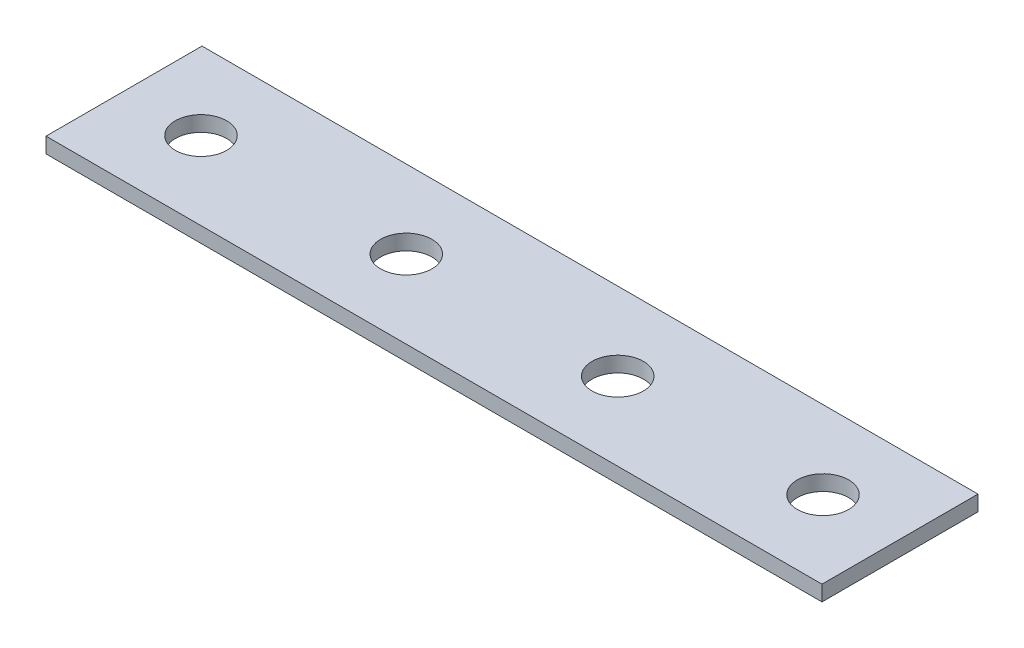
ISO-10303-21;
HEADER;
FILE_DESCRIPTION(('STEP AP214'),'2;1');
FILE_NAME('part.step','',(''),(''),'','','');
FILE_SCHEMA(('AUTOMOTIVE_DESIGN { 1 0 10303 214 1 1 1 1 }'));
ENDSEC;
DATA;
#1=APPLICATION_CONTEXT('core data for automotive mechanical design processes');
#2=APPLICATION_PROTOCOL_DEFINITION('international standard','automotive_design',2000,#1);
#3=PRODUCT_CONTEXT('',#1,'mechanical');
#4=PRODUCT('Part','Part','',(#3));
#5=PRODUCT_RELATED_PRODUCT_CATEGORY('part','',(#4));
#6=PRODUCT_DEFINITION_FORMATION('','',#4);
#7=PRODUCT_DEFINITION_CONTEXT('part definition',#1,'design');
#8=PRODUCT_DEFINITION('design','',#6,#7);
#9=PRODUCT_DEFINITION_SHAPE('','',#8);
#10=(LENGTH_UNIT() NAMED_UNIT(*) SI_UNIT(.MILLI.,.METRE.));
#11=(NAMED_UNIT(*) PLANE_ANGLE_UNIT() SI_UNIT($,.RADIAN.));
#12=(NAMED_UNIT(*) SI_UNIT($,.STERADIAN.) SOLID_ANGLE_UNIT());
#13=UNCERTAINTY_MEASURE_WITH_UNIT(LENGTH_MEASURE(1.E-05),#10,'distance_accuracy_value','');
#14=(GEOMETRIC_REPRESENTATION_CONTEXT(3) GLOBAL_UNCERTAINTY_ASSIGNED_CONTEXT((#13)) GLOBAL_UNIT_ASSIGNED_CONTEXT((#10,
#11,#12)) REPRESENTATION_CONTEXT('',''));
#15=CARTESIAN_POINT('',(0.,0.,0.));
#16=DIRECTION('',(0.,0.,1.));
#17=DIRECTION('',(1.,0.,0.));
#18=AXIS2_PLACEMENT_3D('',#15,#16,#17);
#19=CARTESIAN_POINT('',(0.,1.5,0.));
#20=DIRECTION('',(0.,-1.,0.));
#21=DIRECTION('',(0.,0.,-1.));
#22=AXIS2_PLACEMENT_3D('',#19,#20,#21);
#23=PLANE('',#22);
#24=DIRECTION('',(0.,0.,1.));
#25=VECTOR('',#24,1.);
#26=CARTESIAN_POINT('',(-37.8,1.5,-7.6));
#27=LINE('',#26,#25);
#28=CARTESIAN_POINT('',(-37.8,1.5,-7.6));
#29=VERTEX_POINT('',#28);
#30=CARTESIAN_POINT('',(-37.8,1.5,7.6));
#31=VERTEX_POINT('',#30);
#32=EDGE_CURVE('E88',#29,#31,#27,.T.);
#33=ORIENTED_EDGE('',*,*,#32,.T.);
#34=DIRECTION('',(1.,0.,0.));
#35=VECTOR('',#34,1.);
#36=CARTESIAN_POINT('',(37.8,1.5,7.6));
#37=LINE('',#36,#35);
#38=CARTESIAN_POINT('',(37.8,1.5,7.6));
#39=VERTEX_POINT('',#38);
#40=EDGE_CURVE('E83',#31,#39,#37,.T.);
#41=ORIENTED_EDGE('',*,*,#40,.T.);
#42=DIRECTION('',(0.,0.,-1.));
#43=VECTOR('',#42,1.);
#44=CARTESIAN_POINT('',(37.8,1.5,-7.6));
#45=LINE('',#44,#43);
#46=CARTESIAN_POINT('',(37.8,1.5,-7.6));
#47=VERTEX_POINT('',#46);
#48=EDGE_CURVE('E86',#39,#47,#45,.T.);
#49=ORIENTED_EDGE('',*,*,#48,.T.);
#50=DIRECTION('',(-1.,0.,0.));
#51=VECTOR('',#50,1.);
#52=CARTESIAN_POINT('',(37.8,1.5,-7.6));
#53=LINE('',#52,#51);
#54=EDGE_CURVE('E53',#47,#29,#53,.T.);
#55=ORIENTED_EDGE('',*,*,#54,.T.);
#56=EDGE_LOOP('',(#33,#41,#49,#55));
#57=FACE_BOUND('',#56,.T.);
#58=CARTESIAN_POINT('',(-30.3,1.5,0.));
#59=DIRECTION('',(0.,1.,0.));
#60=DIRECTION('',(0.,0.,1.));
#61=AXIS2_PLACEMENT_3D('',#58,#59,#60);
#62=CIRCLE('',#61,2.5);
#63=CARTESIAN_POINT('',(-30.3,1.5,2.5));
#64=VERTEX_POINT('',#63);
#65=EDGE_CURVE('E103',#64,#64,#62,.T.);
#66=ORIENTED_EDGE('',*,*,#65,.F.);
#67=EDGE_LOOP('',(#66));
#68=FACE_BOUND('',#67,.T.);
#69=CARTESIAN_POINT('',(-10.3,1.5,0.));
#70=DIRECTION('',(0.,1.,0.));
#71=DIRECTION('',(0.,0.,1.));
#72=AXIS2_PLACEMENT_3D('',#69,#70,#71);
#73=CIRCLE('',#72,2.5);
#74=CARTESIAN_POINT('',(-10.3,1.5,2.5));
#75=VERTEX_POINT('',#74);
#76=EDGE_CURVE('E118',#75,#75,#73,.T.);
#77=ORIENTED_EDGE('',*,*,#76,.F.);
#78=EDGE_LOOP('',(#77));
#79=FACE_BOUND('',#78,.T.);
#80=CARTESIAN_POINT('',(10.3,1.5,0.));
#81=DIRECTION('',(0.,1.,0.));
#82=DIRECTION('',(0.,0.,-1.));
#83=AXIS2_PLACEMENT_3D('',#80,#81,#82);
#84=CIRCLE('',#83,2.5);
#85=CARTESIAN_POINT('',(10.3,1.5,-2.5));
#86=VERTEX_POINT('',#85);
#87=EDGE_CURVE('E124',#86,#86,#84,.T.);
#88=ORIENTED_EDGE('',*,*,#87,.F.);
#89=EDGE_LOOP('',(#88));
#90=FACE_BOUND('',#89,.T.);
#91=CARTESIAN_POINT('',(30.3,1.5,0.));
#92=DIRECTION('',(0.,1.,0.));
#93=DIRECTION('',(0.,0.,-1.));
#94=AXIS2_PLACEMENT_3D('',#91,#92,#93);
#95=CIRCLE('',#94,2.49999999999999);
#96=CARTESIAN_POINT('',(30.3,1.5,-2.5));
#97=VERTEX_POINT('',#96);
#98=EDGE_CURVE('E130',#97,#97,#95,.T.);
#99=ORIENTED_EDGE('',*,*,#98,.F.);
#100=EDGE_LOOP('',(#99));
#101=FACE_BOUND('',#100,.T.);
#102=ADVANCED_FACE('F36',(#57,#68,#79,#90,#101),#23,.F.);
#103=CARTESIAN_POINT('',(0.,0.,0.));
#104=DIRECTION('',(0.,-1.,0.));
#105=DIRECTION('',(0.,0.,-1.));
#106=AXIS2_PLACEMENT_3D('',#103,#104,#105);
#107=PLANE('',#106);
#108=CARTESIAN_POINT('',(10.3,0.,0.));
#109=DIRECTION('',(0.,1.,0.));
#110=DIRECTION('',(0.,0.,-1.));
#111=AXIS2_PLACEMENT_3D('',#108,#109,#110);
#112=CIRCLE('',#111,2.5);
#113=CARTESIAN_POINT('',(10.3,0.,-2.5));
#114=VERTEX_POINT('',#113);
#115=EDGE_CURVE('E127',#114,#114,#112,.T.);
#116=ORIENTED_EDGE('',*,*,#115,.T.);
#117=EDGE_LOOP('',(#116));
#118=FACE_BOUND('',#117,.T.);
#119=CARTESIAN_POINT('',(-30.3,0.,0.));
#120=DIRECTION('',(0.,1.,0.));
#121=DIRECTION('',(0.,0.,1.));
#122=AXIS2_PLACEMENT_3D('',#119,#120,#121);
#123=CIRCLE('',#122,2.5);
#124=CARTESIAN_POINT('',(-30.3,0.,2.5));
#125=VERTEX_POINT('',#124);
#126=EDGE_CURVE('E115',#125,#125,#123,.T.);
#127=ORIENTED_EDGE('',*,*,#126,.T.);
#128=EDGE_LOOP('',(#127));
#129=FACE_BOUND('',#128,.T.);
#130=DIRECTION('',(0.,0.,1.));
#131=VECTOR('',#130,1.);
#132=CARTESIAN_POINT('',(-37.8,0.,-7.6));
#133=LINE('',#132,#131);
#134=CARTESIAN_POINT('',(-37.8,0.,-7.6));
#135=VERTEX_POINT('',#134);
#136=CARTESIAN_POINT('',(-37.8,0.,7.6));
#137=VERTEX_POINT('',#136);
#138=EDGE_CURVE('E100',#135,#137,#133,.T.);
#139=ORIENTED_EDGE('',*,*,#138,.F.);
#140=DIRECTION('',(-1.,0.,0.));
#141=VECTOR('',#140,1.);
#142=CARTESIAN_POINT('',(37.8,0.,-7.6));
#143=LINE('',#142,#141);
#144=CARTESIAN_POINT('',(37.8,0.,-7.6));
#145=VERTEX_POINT('',#144);
#146=EDGE_CURVE('E76',#145,#135,#143,.T.);
#147=ORIENTED_EDGE('',*,*,#146,.F.);
#148=DIRECTION('',(0.,0.,-1.));
#149=VECTOR('',#148,1.);
#150=CARTESIAN_POINT('',(37.8,0.,-7.6));
#151=LINE('',#150,#149);
#152=CARTESIAN_POINT('',(37.8,0.,7.6));
#153=VERTEX_POINT('',#152);
#154=EDGE_CURVE('E70',#153,#145,#151,.T.);
#155=ORIENTED_EDGE('',*,*,#154,.F.);
#156=DIRECTION('',(1.,0.,0.));
#157=VECTOR('',#156,1.);
#158=CARTESIAN_POINT('',(37.8,0.,7.6));
#159=LINE('',#158,#157);
#160=EDGE_CURVE('E92',#137,#153,#159,.T.);
#161=ORIENTED_EDGE('',*,*,#160,.F.);
#162=EDGE_LOOP('',(#139,#147,#155,#161));
#163=FACE_BOUND('',#162,.T.);
#164=CARTESIAN_POINT('',(-10.3,0.,0.));
#165=DIRECTION('',(0.,1.,0.));
#166=DIRECTION('',(0.,0.,1.));
#167=AXIS2_PLACEMENT_3D('',#164,#165,#166);
#168=CIRCLE('',#167,2.5);
#169=CARTESIAN_POINT('',(-10.3,0.,2.5));
#170=VERTEX_POINT('',#169);
#171=EDGE_CURVE('E121',#170,#170,#168,.T.);
#172=ORIENTED_EDGE('',*,*,#171,.T.);
#173=EDGE_LOOP('',(#172));
#174=FACE_BOUND('',#173,.T.);
#175=CARTESIAN_POINT('',(30.3,0.,0.));
#176=DIRECTION('',(0.,1.,0.));
#177=DIRECTION('',(0.,0.,-1.));
#178=AXIS2_PLACEMENT_3D('',#175,#176,#177);
#179=CIRCLE('',#178,2.49999999999999);
#180=CARTESIAN_POINT('',(30.3,0.,-2.5));
#181=VERTEX_POINT('',#180);
#182=EDGE_CURVE('E133',#181,#181,#179,.T.);
#183=ORIENTED_EDGE('',*,*,#182,.T.);
#184=EDGE_LOOP('',(#183));
#185=FACE_BOUND('',#184,.T.);
#186=ADVANCED_FACE('F111',(#118,#129,#163,#174,#185),#107,.T.);
#187=CARTESIAN_POINT('',(-37.8,1.5,-7.6));
#188=DIRECTION('',(1.,0.,0.));
#189=DIRECTION('',(0.,0.,-1.));
#190=AXIS2_PLACEMENT_3D('',#187,#188,#189);
#191=PLANE('',#190);
#192=ORIENTED_EDGE('',*,*,#138,.T.);
#193=DIRECTION('',(0.,-1.,0.));
#194=VECTOR('',#193,1.);
#195=CARTESIAN_POINT('',(-37.8,1.5,7.6));
#196=LINE('',#195,#194);
#197=EDGE_CURVE('E11',#31,#137,#196,.T.);
#198=ORIENTED_EDGE('',*,*,#197,.F.);
#199=ORIENTED_EDGE('',*,*,#32,.F.);
#200=DIRECTION('',(0.,-1.,0.));
#201=VECTOR('',#200,1.);
#202=CARTESIAN_POINT('',(-37.8,1.5,-7.6));
#203=LINE('',#202,#201);
#204=EDGE_CURVE('E96',#29,#135,#203,.T.);
#205=ORIENTED_EDGE('',*,*,#204,.T.);
#206=EDGE_LOOP('',(#192,#198,#199,#205));
#207=FACE_BOUND('',#206,.T.);
#208=ADVANCED_FACE('F38',(#207),#191,.F.);
#209=CARTESIAN_POINT('',(37.8,1.5,7.6));
#210=DIRECTION('',(0.,0.,-1.));
#211=DIRECTION('',(-1.,0.,0.));
#212=AXIS2_PLACEMENT_3D('',#209,#210,#211);
#213=PLANE('',#212);
#214=ORIENTED_EDGE('',*,*,#160,.T.);
#215=DIRECTION('',(0.,-1.,0.));
#216=VECTOR('',#215,1.);
#217=CARTESIAN_POINT('',(37.8,1.5,7.6));
#218=LINE('',#217,#216);
#219=EDGE_CURVE('E45',#39,#153,#218,.T.);
#220=ORIENTED_EDGE('',*,*,#219,.F.);
#221=ORIENTED_EDGE('',*,*,#40,.F.);
#222=ORIENTED_EDGE('',*,*,#197,.T.);
#223=EDGE_LOOP('',(#214,#220,#221,#222));
#224=FACE_BOUND('',#223,.T.);
#225=ADVANCED_FACE('F91',(#224),#213,.F.);
#226=CARTESIAN_POINT('',(37.8,1.5,-7.6));
#227=DIRECTION('',(-1.,0.,0.));
#228=DIRECTION('',(0.,0.,1.));
#229=AXIS2_PLACEMENT_3D('',#226,#227,#228);
#230=PLANE('',#229);
#231=ORIENTED_EDGE('',*,*,#154,.T.);
#232=DIRECTION('',(0.,-1.,0.));
#233=VECTOR('',#232,1.);
#234=CARTESIAN_POINT('',(37.8,1.5,-7.6));
#235=LINE('',#234,#233);
#236=EDGE_CURVE('E93',#47,#145,#235,.T.);
#237=ORIENTED_EDGE('',*,*,#236,.F.);
#238=ORIENTED_EDGE('',*,*,#48,.F.);
#239=ORIENTED_EDGE('',*,*,#219,.T.);
#240=EDGE_LOOP('',(#231,#237,#238,#239));
#241=FACE_BOUND('',#240,.T.);
#242=ADVANCED_FACE('F94',(#241),#230,.F.);
#243=CARTESIAN_POINT('',(37.8,1.5,-7.6));
#244=DIRECTION('',(0.,0.,1.));
#245=DIRECTION('',(1.,0.,0.));
#246=AXIS2_PLACEMENT_3D('',#243,#244,#245);
#247=PLANE('',#246);
#248=ORIENTED_EDGE('',*,*,#146,.T.);
#249=ORIENTED_EDGE('',*,*,#204,.F.);
#250=ORIENTED_EDGE('',*,*,#54,.F.);
#251=ORIENTED_EDGE('',*,*,#236,.T.);
#252=EDGE_LOOP('',(#248,#249,#250,#251));
#253=FACE_BOUND('',#252,.T.);
#254=ADVANCED_FACE('F108',(#253),#247,.F.);
#255=CARTESIAN_POINT('',(-30.3,1.5,0.));
#256=DIRECTION('',(0.,-1.,0.));
#257=DIRECTION('',(0.,0.,-1.));
#258=AXIS2_PLACEMENT_3D('',#255,#256,#257);
#259=CYLINDRICAL_SURFACE('',#258,2.5);
#260=ORIENTED_EDGE('',*,*,#65,.T.);
#261=EDGE_LOOP('',(#260));
#262=FACE_BOUND('',#261,.T.);
#263=ORIENTED_EDGE('',*,*,#126,.F.);
#264=EDGE_LOOP('',(#263));
#265=FACE_BOUND('',#264,.T.);
#266=ADVANCED_FACE('F150',(#262,#265),#259,.F.);
#267=CARTESIAN_POINT('',(-10.3,1.5,0.));
#268=DIRECTION('',(0.,-1.,0.));
#269=DIRECTION('',(0.,0.,-1.));
#270=AXIS2_PLACEMENT_3D('',#267,#268,#269);
#271=CYLINDRICAL_SURFACE('',#270,2.5);
#272=ORIENTED_EDGE('',*,*,#76,.T.);
#273=EDGE_LOOP('',(#272));
#274=FACE_BOUND('',#273,.T.);
#275=ORIENTED_EDGE('',*,*,#171,.F.);
#276=EDGE_LOOP('',(#275));
#277=FACE_BOUND('',#276,.T.);
#278=ADVANCED_FACE('F196',(#274,#277),#271,.F.);
#279=CARTESIAN_POINT('',(10.3,1.5,0.));
#280=DIRECTION('',(0.,-1.,0.));
#281=DIRECTION('',(0.,0.,-1.));
#282=AXIS2_PLACEMENT_3D('',#279,#280,#281);
#283=CYLINDRICAL_SURFACE('',#282,2.5);
#284=ORIENTED_EDGE('',*,*,#87,.T.);
#285=EDGE_LOOP('',(#284));
#286=FACE_BOUND('',#285,.T.);
#287=ORIENTED_EDGE('',*,*,#115,.F.);
#288=EDGE_LOOP('',(#287));
#289=FACE_BOUND('',#288,.T.);
#290=ADVANCED_FACE('F204',(#286,#289),#283,.F.);
#291=CARTESIAN_POINT('',(30.3,1.5,0.));
#292=DIRECTION('',(0.,-1.,0.));
#293=DIRECTION('',(0.,0.,-1.));
#294=AXIS2_PLACEMENT_3D('',#291,#292,#293);
#295=CYLINDRICAL_SURFACE('',#294,2.49999999999999);
#296=ORIENTED_EDGE('',*,*,#98,.T.);
#297=EDGE_LOOP('',(#296));
#298=FACE_BOUND('',#297,.T.);
#299=ORIENTED_EDGE('',*,*,#182,.F.);
#300=EDGE_LOOP('',(#299));
#301=FACE_BOUND('',#300,.T.);
#302=ADVANCED_FACE('F139',(#298,#301),#295,.F.);
#303=CLOSED_SHELL('',(#102,#186,#208,#225,#242,#254,#266,#278,#290,#302));
#304=MANIFOLD_SOLID_BREP('B2',#303);
#305=ADVANCED_BREP_SHAPE_REPRESENTATION('',(#18,#304),#14);
#306=SHAPE_DEFINITION_REPRESENTATION(#9,#305);
ENDSEC;
END-ISO-10303-21;
